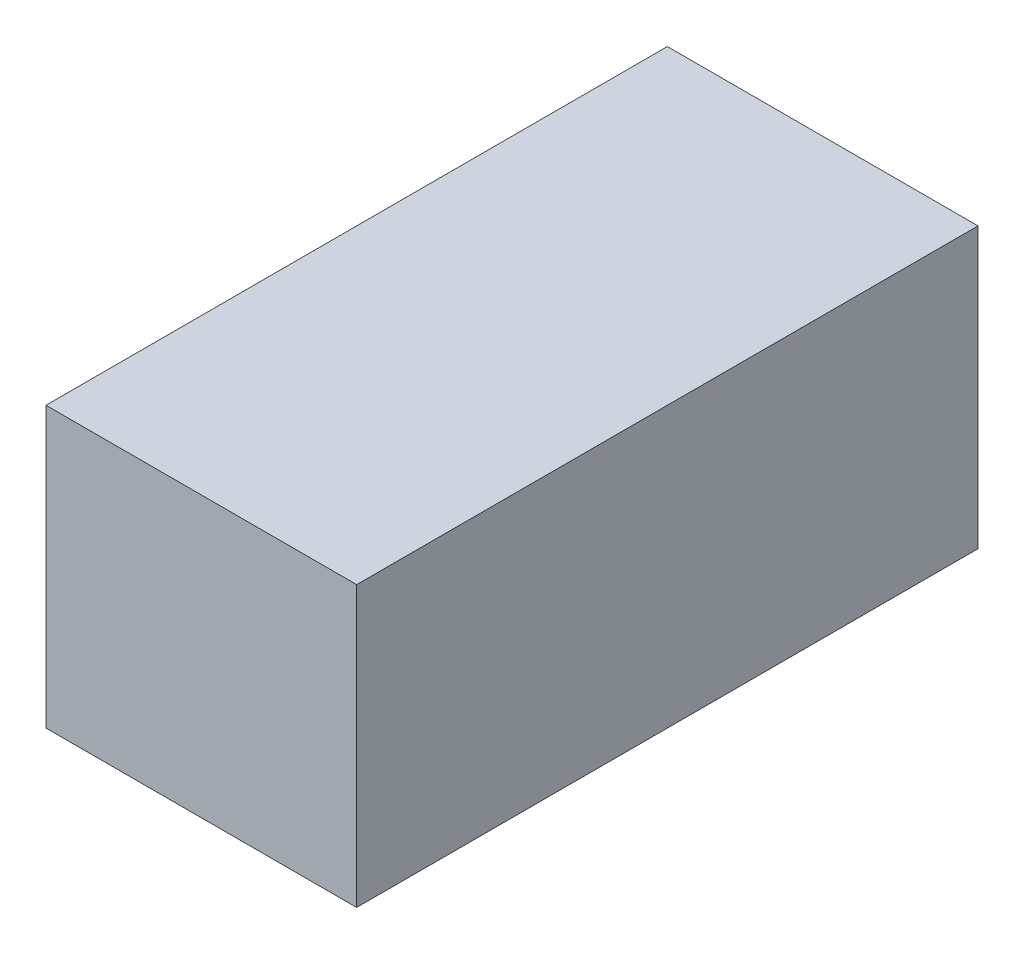
ISO-10303-21;
HEADER;
FILE_DESCRIPTION(('STEP AP214'),'2;1');
FILE_NAME('part.step','',(''),(''),'','','');
FILE_SCHEMA(('AUTOMOTIVE_DESIGN { 1 0 10303 214 1 1 1 1 }'));
ENDSEC;
DATA;
#1=APPLICATION_CONTEXT('core data for automotive mechanical design processes');
#2=APPLICATION_PROTOCOL_DEFINITION('international standard','automotive_design',2000,#1);
#3=PRODUCT_CONTEXT('',#1,'mechanical');
#4=PRODUCT('Part','Part','',(#3));
#5=PRODUCT_RELATED_PRODUCT_CATEGORY('part','',(#4));
#6=PRODUCT_DEFINITION_FORMATION('','',#4);
#7=PRODUCT_DEFINITION_CONTEXT('part definition',#1,'design');
#8=PRODUCT_DEFINITION('design','',#6,#7);
#9=PRODUCT_DEFINITION_SHAPE('','',#8);
#10=(LENGTH_UNIT() NAMED_UNIT(*) SI_UNIT(.MILLI.,.METRE.));
#11=(NAMED_UNIT(*) PLANE_ANGLE_UNIT() SI_UNIT($,.RADIAN.));
#12=(NAMED_UNIT(*) SI_UNIT($,.STERADIAN.) SOLID_ANGLE_UNIT());
#13=UNCERTAINTY_MEASURE_WITH_UNIT(LENGTH_MEASURE(1.E-05),#10,'distance_accuracy_value','');
#14=(GEOMETRIC_REPRESENTATION_CONTEXT(3) GLOBAL_UNCERTAINTY_ASSIGNED_CONTEXT((#13)) GLOBAL_UNIT_ASSIGNED_CONTEXT((#10,
#11,#12)) REPRESENTATION_CONTEXT('',''));
#15=CARTESIAN_POINT('',(0.,0.,0.));
#16=DIRECTION('',(0.,0.,1.));
#17=DIRECTION('',(1.,0.,0.));
#18=AXIS2_PLACEMENT_3D('',#15,#16,#17);
#19=CARTESIAN_POINT('',(100.,-90.,400.));
#20=DIRECTION('',(-1.,0.,0.));
#21=DIRECTION('',(0.,0.,1.));
#22=AXIS2_PLACEMENT_3D('',#19,#20,#21);
#23=PLANE('',#22);
#24=DIRECTION('',(0.,1.,0.));
#25=VECTOR('',#24,1.);
#26=CARTESIAN_POINT('',(100.,-90.,0.));
#27=LINE('',#26,#25);
#28=CARTESIAN_POINT('',(100.,-90.,0.));
#29=VERTEX_POINT('',#28);
#30=CARTESIAN_POINT('',(100.,90.,0.));
#31=VERTEX_POINT('',#30);
#32=EDGE_CURVE('E103',#29,#31,#27,.T.);
#33=ORIENTED_EDGE('',*,*,#32,.T.);
#34=DIRECTION('',(0.,0.,-1.));
#35=VECTOR('',#34,1.);
#36=CARTESIAN_POINT('',(100.,90.,400.));
#37=LINE('',#36,#35);
#38=CARTESIAN_POINT('',(100.,90.,400.));
#39=VERTEX_POINT('',#38);
#40=EDGE_CURVE('E11',#39,#31,#37,.T.);
#41=ORIENTED_EDGE('',*,*,#40,.F.);
#42=DIRECTION('',(0.,1.,0.));
#43=VECTOR('',#42,1.);
#44=CARTESIAN_POINT('',(100.,-90.,400.));
#45=LINE('',#44,#43);
#46=CARTESIAN_POINT('',(100.,-90.,400.));
#47=VERTEX_POINT('',#46);
#48=EDGE_CURVE('E91',#47,#39,#45,.T.);
#49=ORIENTED_EDGE('',*,*,#48,.F.);
#50=DIRECTION('',(0.,0.,-1.));
#51=VECTOR('',#50,1.);
#52=CARTESIAN_POINT('',(100.,-90.,400.));
#53=LINE('',#52,#51);
#54=EDGE_CURVE('E99',#47,#29,#53,.T.);
#55=ORIENTED_EDGE('',*,*,#54,.T.);
#56=EDGE_LOOP('',(#33,#41,#49,#55));
#57=FACE_BOUND('',#56,.T.);
#58=ADVANCED_FACE('F40',(#57),#23,.F.);
#59=CARTESIAN_POINT('',(-100.,90.,400.));
#60=DIRECTION('',(0.,-1.,0.));
#61=DIRECTION('',(0.,0.,-1.));
#62=AXIS2_PLACEMENT_3D('',#59,#60,#61);
#63=PLANE('',#62);
#64=DIRECTION('',(-1.,0.,0.));
#65=VECTOR('',#64,1.);
#66=CARTESIAN_POINT('',(-100.,90.,0.));
#67=LINE('',#66,#65);
#68=CARTESIAN_POINT('',(-100.,90.,0.));
#69=VERTEX_POINT('',#68);
#70=EDGE_CURVE('E95',#31,#69,#67,.T.);
#71=ORIENTED_EDGE('',*,*,#70,.T.);
#72=DIRECTION('',(0.,0.,-1.));
#73=VECTOR('',#72,1.);
#74=CARTESIAN_POINT('',(-100.,90.,400.));
#75=LINE('',#74,#73);
#76=CARTESIAN_POINT('',(-100.,90.,400.));
#77=VERTEX_POINT('',#76);
#78=EDGE_CURVE('E48',#77,#69,#75,.T.);
#79=ORIENTED_EDGE('',*,*,#78,.F.);
#80=DIRECTION('',(-1.,0.,0.));
#81=VECTOR('',#80,1.);
#82=CARTESIAN_POINT('',(-100.,90.,400.));
#83=LINE('',#82,#81);
#84=EDGE_CURVE('E86',#39,#77,#83,.T.);
#85=ORIENTED_EDGE('',*,*,#84,.F.);
#86=ORIENTED_EDGE('',*,*,#40,.T.);
#87=EDGE_LOOP('',(#71,#79,#85,#86));
#88=FACE_BOUND('',#87,.T.);
#89=ADVANCED_FACE('F94',(#88),#63,.F.);
#90=CARTESIAN_POINT('',(-100.,-90.,400.));
#91=DIRECTION('',(1.,0.,0.));
#92=DIRECTION('',(0.,0.,-1.));
#93=AXIS2_PLACEMENT_3D('',#90,#91,#92);
#94=PLANE('',#93);
#95=DIRECTION('',(0.,-1.,0.));
#96=VECTOR('',#95,1.);
#97=CARTESIAN_POINT('',(-100.,-90.,0.));
#98=LINE('',#97,#96);
#99=CARTESIAN_POINT('',(-100.,-90.,0.));
#100=VERTEX_POINT('',#99);
#101=EDGE_CURVE('E73',#69,#100,#98,.T.);
#102=ORIENTED_EDGE('',*,*,#101,.T.);
#103=DIRECTION('',(0.,0.,-1.));
#104=VECTOR('',#103,1.);
#105=CARTESIAN_POINT('',(-100.,-90.,400.));
#106=LINE('',#105,#104);
#107=CARTESIAN_POINT('',(-100.,-90.,400.));
#108=VERTEX_POINT('',#107);
#109=EDGE_CURVE('E96',#108,#100,#106,.T.);
#110=ORIENTED_EDGE('',*,*,#109,.F.);
#111=DIRECTION('',(0.,-1.,0.));
#112=VECTOR('',#111,1.);
#113=CARTESIAN_POINT('',(-100.,-90.,400.));
#114=LINE('',#113,#112);
#115=EDGE_CURVE('E89',#77,#108,#114,.T.);
#116=ORIENTED_EDGE('',*,*,#115,.F.);
#117=ORIENTED_EDGE('',*,*,#78,.T.);
#118=EDGE_LOOP('',(#102,#110,#116,#117));
#119=FACE_BOUND('',#118,.T.);
#120=ADVANCED_FACE('F97',(#119),#94,.F.);
#121=CARTESIAN_POINT('',(-100.,-90.,400.));
#122=DIRECTION('',(0.,1.,0.));
#123=DIRECTION('',(0.,0.,1.));
#124=AXIS2_PLACEMENT_3D('',#121,#122,#123);
#125=PLANE('',#124);
#126=DIRECTION('',(1.,0.,0.));
#127=VECTOR('',#126,1.);
#128=CARTESIAN_POINT('',(-100.,-90.,0.));
#129=LINE('',#128,#127);
#130=EDGE_CURVE('E79',#100,#29,#129,.T.);
#131=ORIENTED_EDGE('',*,*,#130,.T.);
#132=ORIENTED_EDGE('',*,*,#54,.F.);
#133=DIRECTION('',(1.,0.,0.));
#134=VECTOR('',#133,1.);
#135=CARTESIAN_POINT('',(-100.,-90.,400.));
#136=LINE('',#135,#134);
#137=EDGE_CURVE('E56',#108,#47,#136,.T.);
#138=ORIENTED_EDGE('',*,*,#137,.F.);
#139=ORIENTED_EDGE('',*,*,#109,.T.);
#140=EDGE_LOOP('',(#131,#132,#138,#139));
#141=FACE_BOUND('',#140,.T.);
#142=ADVANCED_FACE('F110',(#141),#125,.F.);
#143=CARTESIAN_POINT('',(0.,0.,400.));
#144=DIRECTION('',(0.,0.,-1.));
#145=DIRECTION('',(-1.,0.,0.));
#146=AXIS2_PLACEMENT_3D('',#143,#144,#145);
#147=PLANE('',#146);
#148=ORIENTED_EDGE('',*,*,#48,.T.);
#149=ORIENTED_EDGE('',*,*,#84,.T.);
#150=ORIENTED_EDGE('',*,*,#115,.T.);
#151=ORIENTED_EDGE('',*,*,#137,.T.);
#152=EDGE_LOOP('',(#148,#149,#150,#151));
#153=FACE_BOUND('',#152,.T.);
#154=ADVANCED_FACE('F87',(#153),#147,.F.);
#155=CARTESIAN_POINT('',(0.,0.,0.));
#156=DIRECTION('',(0.,0.,-1.));
#157=DIRECTION('',(-1.,0.,0.));
#158=AXIS2_PLACEMENT_3D('',#155,#156,#157);
#159=PLANE('',#158);
#160=ORIENTED_EDGE('',*,*,#32,.F.);
#161=ORIENTED_EDGE('',*,*,#130,.F.);
#162=ORIENTED_EDGE('',*,*,#101,.F.);
#163=ORIENTED_EDGE('',*,*,#70,.F.);
#164=EDGE_LOOP('',(#160,#161,#162,#163));
#165=FACE_BOUND('',#164,.T.);
#166=ADVANCED_FACE('F113',(#165),#159,.T.);
#167=CLOSED_SHELL('',(#58,#89,#120,#142,#154,#166));
#168=MANIFOLD_SOLID_BREP('B2',#167);
#169=ADVANCED_BREP_SHAPE_REPRESENTATION('',(#18,#168),#14);
#170=SHAPE_DEFINITION_REPRESENTATION(#9,#169);
ENDSEC;
END-ISO-10303-21;
